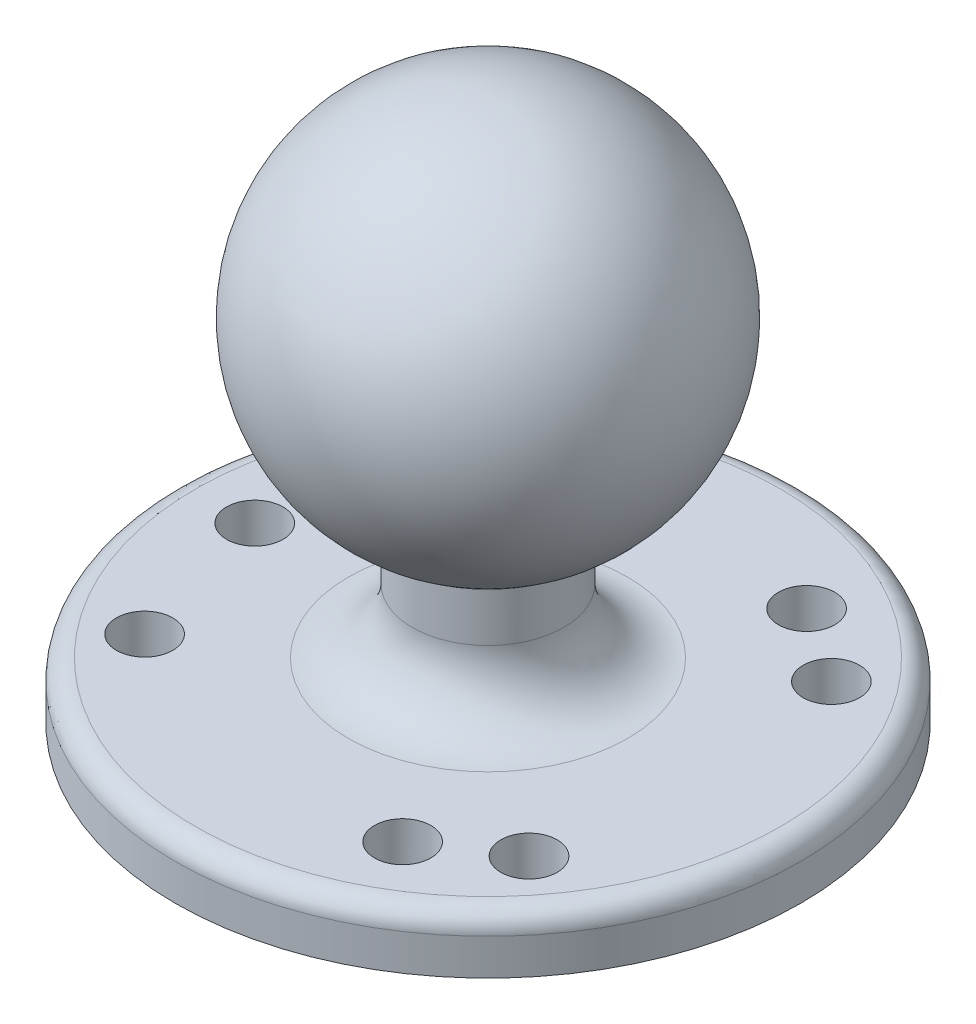
ISO-10303-21;
HEADER;
FILE_DESCRIPTION(('STEP AP214'),'2;1');
FILE_NAME('part.step','',(''),(''),'','','');
FILE_SCHEMA(('AUTOMOTIVE_DESIGN { 1 0 10303 214 1 1 1 1 }'));
ENDSEC;
DATA;
#1=APPLICATION_CONTEXT('core data for automotive mechanical design processes');
#2=APPLICATION_PROTOCOL_DEFINITION('international standard','automotive_design',2000,#1);
#3=PRODUCT_CONTEXT('',#1,'mechanical');
#4=PRODUCT('Part','Part','',(#3));
#5=PRODUCT_RELATED_PRODUCT_CATEGORY('part','',(#4));
#6=PRODUCT_DEFINITION_FORMATION('','',#4);
#7=PRODUCT_DEFINITION_CONTEXT('part definition',#1,'design');
#8=PRODUCT_DEFINITION('design','',#6,#7);
#9=PRODUCT_DEFINITION_SHAPE('','',#8);
#10=(LENGTH_UNIT() NAMED_UNIT(*) SI_UNIT(.MILLI.,.METRE.));
#11=(NAMED_UNIT(*) PLANE_ANGLE_UNIT() SI_UNIT($,.RADIAN.));
#12=(NAMED_UNIT(*) SI_UNIT($,.STERADIAN.) SOLID_ANGLE_UNIT());
#13=UNCERTAINTY_MEASURE_WITH_UNIT(LENGTH_MEASURE(1.E-05),#10,'distance_accuracy_value','');
#14=(GEOMETRIC_REPRESENTATION_CONTEXT(3) GLOBAL_UNCERTAINTY_ASSIGNED_CONTEXT((#13)) GLOBAL_UNIT_ASSIGNED_CONTEXT((#10,
#11,#12)) REPRESENTATION_CONTEXT('',''));
#15=CARTESIAN_POINT('',(0.,0.,0.));
#16=DIRECTION('',(0.,0.,1.));
#17=DIRECTION('',(1.,0.,0.));
#18=AXIS2_PLACEMENT_3D('',#15,#16,#17);
#19=CARTESIAN_POINT('',(0.,0.,0.));
#20=DIRECTION('',(0.,-1.,0.));
#21=DIRECTION('',(0.,0.,-1.));
#22=AXIS2_PLACEMENT_3D('',#19,#20,#21);
#23=PLANE('',#22);
#24=CARTESIAN_POINT('',(-19.05,0.,-14.9860000000001));
#25=DIRECTION('',(0.,-1.,0.));
#26=DIRECTION('',(0.,0.,-1.));
#27=AXIS2_PLACEMENT_3D('',#24,#25,#26);
#28=CIRCLE('',#27,2.794);
#29=CARTESIAN_POINT('',(-19.05,0.,-17.7800000000001));
#30=VERTEX_POINT('',#29);
#31=EDGE_CURVE('E118',#30,#30,#28,.T.);
#32=ORIENTED_EDGE('',*,*,#31,.F.);
#33=EDGE_LOOP('',(#32));
#34=FACE_BOUND('',#33,.T.);
#35=CARTESIAN_POINT('',(19.05,0.,-14.9860000000001));
#36=DIRECTION('',(0.,-1.,0.));
#37=DIRECTION('',(0.,0.,-1.));
#38=AXIS2_PLACEMENT_3D('',#35,#36,#37);
#39=CIRCLE('',#38,2.794);
#40=CARTESIAN_POINT('',(19.05,0.,-17.7800000000001));
#41=VERTEX_POINT('',#40);
#42=EDGE_CURVE('E122',#41,#41,#39,.T.);
#43=ORIENTED_EDGE('',*,*,#42,.F.);
#44=EDGE_LOOP('',(#43));
#45=FACE_BOUND('',#44,.T.);
#46=CARTESIAN_POINT('',(19.05,0.,14.986));
#47=DIRECTION('',(0.,-1.,0.));
#48=DIRECTION('',(0.,0.,-1.));
#49=AXIS2_PLACEMENT_3D('',#46,#47,#48);
#50=CIRCLE('',#49,2.794);
#51=CARTESIAN_POINT('',(19.05,0.,12.192));
#52=VERTEX_POINT('',#51);
#53=EDGE_CURVE('E126',#52,#52,#50,.T.);
#54=ORIENTED_EDGE('',*,*,#53,.F.);
#55=EDGE_LOOP('',(#54));
#56=FACE_BOUND('',#55,.T.);
#57=CARTESIAN_POINT('',(11.557,0.,-20.0173111830735));
#58=DIRECTION('',(0.,-1.,0.));
#59=DIRECTION('',(0.,0.,-1.));
#60=AXIS2_PLACEMENT_3D('',#57,#58,#59);
#61=CIRCLE('',#60,2.794);
#62=CARTESIAN_POINT('',(11.557,0.,-22.8113111830735));
#63=VERTEX_POINT('',#62);
#64=EDGE_CURVE('E79',#63,#63,#61,.T.);
#65=ORIENTED_EDGE('',*,*,#64,.F.);
#66=EDGE_LOOP('',(#65));
#67=FACE_BOUND('',#66,.T.);
#68=CARTESIAN_POINT('',(11.557,0.,20.0173111830735));
#69=DIRECTION('',(0.,-1.,0.));
#70=DIRECTION('',(0.,0.,-1.));
#71=AXIS2_PLACEMENT_3D('',#68,#69,#70);
#72=CIRCLE('',#71,2.794);
#73=CARTESIAN_POINT('',(11.557,0.,17.2233111830735));
#74=VERTEX_POINT('',#73);
#75=EDGE_CURVE('E133',#74,#74,#72,.T.);
#76=ORIENTED_EDGE('',*,*,#75,.F.);
#77=EDGE_LOOP('',(#76));
#78=FACE_BOUND('',#77,.T.);
#79=CARTESIAN_POINT('',(-19.05,0.,14.986));
#80=DIRECTION('',(0.,-1.,0.));
#81=DIRECTION('',(0.,0.,-1.));
#82=AXIS2_PLACEMENT_3D('',#79,#80,#81);
#83=CIRCLE('',#82,2.794);
#84=CARTESIAN_POINT('',(-19.05,0.,12.192));
#85=VERTEX_POINT('',#84);
#86=EDGE_CURVE('E58',#85,#85,#83,.T.);
#87=ORIENTED_EDGE('',*,*,#86,.F.);
#88=EDGE_LOOP('',(#87));
#89=FACE_BOUND('',#88,.T.);
#90=CARTESIAN_POINT('',(-23.114,0.,0.));
#91=DIRECTION('',(0.,-1.,0.));
#92=DIRECTION('',(0.,0.,-1.));
#93=AXIS2_PLACEMENT_3D('',#90,#91,#92);
#94=CIRCLE('',#93,2.794);
#95=CARTESIAN_POINT('',(-23.114,0.,-2.794));
#96=VERTEX_POINT('',#95);
#97=EDGE_CURVE('E53',#96,#96,#94,.T.);
#98=ORIENTED_EDGE('',*,*,#97,.F.);
#99=EDGE_LOOP('',(#98));
#100=FACE_BOUND('',#99,.T.);
#101=CARTESIAN_POINT('',(0.,0.,0.));
#102=DIRECTION('',(0.,-1.,0.));
#103=DIRECTION('',(0.,0.,-1.));
#104=AXIS2_PLACEMENT_3D('',#101,#102,#103);
#105=CIRCLE('',#104,30.988);
#106=CARTESIAN_POINT('',(0.,0.,-30.988));
#107=VERTEX_POINT('',#106);
#108=EDGE_CURVE('E10',#107,#107,#105,.T.);
#109=ORIENTED_EDGE('',*,*,#108,.T.);
#110=EDGE_LOOP('',(#109));
#111=FACE_BOUND('',#110,.T.);
#112=ADVANCED_FACE('F33',(#34,#45,#56,#67,#78,#89,#100,#111),#23,.T.);
#113=CARTESIAN_POINT('',(0.,0.,0.));
#114=DIRECTION('',(0.,-1.,0.));
#115=DIRECTION('',(0.,0.,-1.));
#116=AXIS2_PLACEMENT_3D('',#113,#114,#115);
#117=CYLINDRICAL_SURFACE('',#116,30.988);
#118=CARTESIAN_POINT('',(0.,3.588,0.));
#119=DIRECTION('',(0.,-1.,0.));
#120=DIRECTION('',(0.,0.,-1.));
#121=AXIS2_PLACEMENT_3D('',#118,#119,#120);
#122=CIRCLE('',#121,30.988);
#123=CARTESIAN_POINT('',(0.,3.588,-30.988));
#124=VERTEX_POINT('',#123);
#125=EDGE_CURVE('E40',#124,#124,#122,.T.);
#126=ORIENTED_EDGE('',*,*,#125,.T.);
#127=EDGE_LOOP('',(#126));
#128=FACE_BOUND('',#127,.T.);
#129=ORIENTED_EDGE('',*,*,#108,.F.);
#130=EDGE_LOOP('',(#129));
#131=FACE_BOUND('',#130,.T.);
#132=ADVANCED_FACE('F106',(#128,#131),#117,.T.);
#133=CARTESIAN_POINT('',(0.,3.588,0.));
#134=DIRECTION('',(0.,-1.,0.));
#135=DIRECTION('',(0.,0.,-1.));
#136=AXIS2_PLACEMENT_3D('',#133,#134,#135);
#137=TOROIDAL_SURFACE('',#136,28.988,2.);
#138=CARTESIAN_POINT('',(0.,5.588,0.));
#139=DIRECTION('',(0.,-1.,0.));
#140=DIRECTION('',(0.,0.,-1.));
#141=AXIS2_PLACEMENT_3D('',#138,#139,#140);
#142=CIRCLE('',#141,28.988);
#143=CARTESIAN_POINT('',(0.,5.588,-28.988));
#144=VERTEX_POINT('',#143);
#145=EDGE_CURVE('E45',#144,#144,#142,.T.);
#146=ORIENTED_EDGE('',*,*,#145,.T.);
#147=EDGE_LOOP('',(#146));
#148=FACE_BOUND('',#147,.T.);
#149=ORIENTED_EDGE('',*,*,#125,.F.);
#150=EDGE_LOOP('',(#149));
#151=FACE_BOUND('',#150,.T.);
#152=ADVANCED_FACE('F91',(#148,#151),#137,.T.);
#153=CARTESIAN_POINT('',(28.988,5.588,0.));
#154=DIRECTION('',(0.,1.,0.));
#155=DIRECTION('',(0.,0.,1.));
#156=AXIS2_PLACEMENT_3D('',#153,#154,#155);
#157=PLANE('',#156);
#158=CARTESIAN_POINT('',(-19.05,5.588,-14.9860000000001));
#159=DIRECTION('',(0.,1.,0.));
#160=DIRECTION('',(0.,0.,1.));
#161=AXIS2_PLACEMENT_3D('',#158,#159,#160);
#162=CIRCLE('',#161,2.794);
#163=CARTESIAN_POINT('',(-19.05,5.588,-12.1920000000001));
#164=VERTEX_POINT('',#163);
#165=EDGE_CURVE('E36',#164,#164,#162,.T.);
#166=ORIENTED_EDGE('',*,*,#165,.F.);
#167=EDGE_LOOP('',(#166));
#168=FACE_BOUND('',#167,.T.);
#169=CARTESIAN_POINT('',(19.05,5.588,-14.9860000000001));
#170=DIRECTION('',(0.,1.,0.));
#171=DIRECTION('',(0.,0.,1.));
#172=AXIS2_PLACEMENT_3D('',#169,#170,#171);
#173=CIRCLE('',#172,2.794);
#174=CARTESIAN_POINT('',(19.05,5.588,-12.1920000000001));
#175=VERTEX_POINT('',#174);
#176=EDGE_CURVE('E66',#175,#175,#173,.T.);
#177=ORIENTED_EDGE('',*,*,#176,.F.);
#178=EDGE_LOOP('',(#177));
#179=FACE_BOUND('',#178,.T.);
#180=CARTESIAN_POINT('',(19.05,5.588,14.986));
#181=DIRECTION('',(0.,1.,0.));
#182=DIRECTION('',(0.,0.,1.));
#183=AXIS2_PLACEMENT_3D('',#180,#181,#182);
#184=CIRCLE('',#183,2.794);
#185=CARTESIAN_POINT('',(19.05,5.588,17.78));
#186=VERTEX_POINT('',#185);
#187=EDGE_CURVE('E64',#186,#186,#184,.T.);
#188=ORIENTED_EDGE('',*,*,#187,.F.);
#189=EDGE_LOOP('',(#188));
#190=FACE_BOUND('',#189,.T.);
#191=CARTESIAN_POINT('',(11.557,5.588,-20.0173111830735));
#192=DIRECTION('',(0.,1.,0.));
#193=DIRECTION('',(0.,0.,1.));
#194=AXIS2_PLACEMENT_3D('',#191,#192,#193);
#195=CIRCLE('',#194,2.794);
#196=CARTESIAN_POINT('',(11.557,5.588,-17.2233111830735));
#197=VERTEX_POINT('',#196);
#198=EDGE_CURVE('E61',#197,#197,#195,.T.);
#199=ORIENTED_EDGE('',*,*,#198,.F.);
#200=EDGE_LOOP('',(#199));
#201=FACE_BOUND('',#200,.T.);
#202=CARTESIAN_POINT('',(11.557,5.588,20.0173111830735));
#203=DIRECTION('',(0.,1.,0.));
#204=DIRECTION('',(0.,0.,1.));
#205=AXIS2_PLACEMENT_3D('',#202,#203,#204);
#206=CIRCLE('',#205,2.794);
#207=CARTESIAN_POINT('',(11.557,5.588,22.8113111830735));
#208=VERTEX_POINT('',#207);
#209=EDGE_CURVE('E57',#208,#208,#206,.T.);
#210=ORIENTED_EDGE('',*,*,#209,.F.);
#211=EDGE_LOOP('',(#210));
#212=FACE_BOUND('',#211,.T.);
#213=CARTESIAN_POINT('',(-19.05,5.588,14.986));
#214=DIRECTION('',(0.,1.,0.));
#215=DIRECTION('',(0.,0.,1.));
#216=AXIS2_PLACEMENT_3D('',#213,#214,#215);
#217=CIRCLE('',#216,2.794);
#218=CARTESIAN_POINT('',(-19.05,5.588,17.78));
#219=VERTEX_POINT('',#218);
#220=EDGE_CURVE('E54',#219,#219,#217,.T.);
#221=ORIENTED_EDGE('',*,*,#220,.F.);
#222=EDGE_LOOP('',(#221));
#223=FACE_BOUND('',#222,.T.);
#224=CARTESIAN_POINT('',(-23.114,5.588,0.));
#225=DIRECTION('',(0.,1.,0.));
#226=DIRECTION('',(0.,0.,1.));
#227=AXIS2_PLACEMENT_3D('',#224,#225,#226);
#228=CIRCLE('',#227,2.794);
#229=CARTESIAN_POINT('',(-23.114,5.588,2.794));
#230=VERTEX_POINT('',#229);
#231=EDGE_CURVE('E49',#230,#230,#228,.T.);
#232=ORIENTED_EDGE('',*,*,#231,.F.);
#233=EDGE_LOOP('',(#232));
#234=FACE_BOUND('',#233,.T.);
#235=CARTESIAN_POINT('',(0.,5.588,0.));
#236=DIRECTION('',(0.,-1.,0.));
#237=DIRECTION('',(0.,0.,-1.));
#238=AXIS2_PLACEMENT_3D('',#235,#236,#237);
#239=CIRCLE('',#238,13.85);
#240=CARTESIAN_POINT('',(0.,5.588,-13.85));
#241=VERTEX_POINT('',#240);
#242=EDGE_CURVE('E86',#241,#241,#239,.T.);
#243=ORIENTED_EDGE('',*,*,#242,.T.);
#244=EDGE_LOOP('',(#243));
#245=FACE_BOUND('',#244,.T.);
#246=ORIENTED_EDGE('',*,*,#145,.F.);
#247=EDGE_LOOP('',(#246));
#248=FACE_BOUND('',#247,.T.);
#249=ADVANCED_FACE('F94',(#168,#179,#190,#201,#212,#223,#234,#245,#248),#157,.T.);
#250=CARTESIAN_POINT('',(0.,11.938,0.));
#251=DIRECTION('',(0.,-1.,0.));
#252=DIRECTION('',(0.,0.,-1.));
#253=AXIS2_PLACEMENT_3D('',#250,#251,#252);
#254=TOROIDAL_SURFACE('',#253,13.85,6.35);
#255=CARTESIAN_POINT('',(0.,11.938,0.));
#256=DIRECTION('',(0.,-1.,0.));
#257=DIRECTION('',(0.,0.,-1.));
#258=AXIS2_PLACEMENT_3D('',#255,#256,#257);
#259=CIRCLE('',#258,7.5);
#260=CARTESIAN_POINT('',(0.,11.938,-7.5));
#261=VERTEX_POINT('',#260);
#262=EDGE_CURVE('E83',#261,#261,#259,.T.);
#263=ORIENTED_EDGE('',*,*,#262,.T.);
#264=EDGE_LOOP('',(#263));
#265=FACE_BOUND('',#264,.T.);
#266=ORIENTED_EDGE('',*,*,#242,.F.);
#267=EDGE_LOOP('',(#266));
#268=FACE_BOUND('',#267,.T.);
#269=ADVANCED_FACE('F96',(#265,#268),#254,.F.);
#270=CARTESIAN_POINT('',(0.,0.,0.));
#271=DIRECTION('',(0.,-1.,0.));
#272=DIRECTION('',(0.,0.,-1.));
#273=AXIS2_PLACEMENT_3D('',#270,#271,#272);
#274=CYLINDRICAL_SURFACE('',#273,7.5);
#275=CARTESIAN_POINT('',(0.,17.2865037760904,0.));
#276=DIRECTION('',(0.,-1.,0.));
#277=DIRECTION('',(0.,0.,-1.));
#278=AXIS2_PLACEMENT_3D('',#275,#276,#277);
#279=CIRCLE('',#278,7.5);
#280=CARTESIAN_POINT('',(0.,17.2865037760904,-7.5));
#281=VERTEX_POINT('',#280);
#282=EDGE_CURVE('E52',#281,#281,#279,.T.);
#283=ORIENTED_EDGE('',*,*,#282,.T.);
#284=EDGE_LOOP('',(#283));
#285=FACE_BOUND('',#284,.T.);
#286=ORIENTED_EDGE('',*,*,#262,.F.);
#287=EDGE_LOOP('',(#286));
#288=FACE_BOUND('',#287,.T.);
#289=ADVANCED_FACE('F103',(#285,#288),#274,.T.);
#290=CARTESIAN_POINT('',(0.,34.798,0.));
#291=DIRECTION('',(0.,-1.,0.));
#292=DIRECTION('',(1.,0.,0.));
#293=AXIS2_PLACEMENT_3D('',#290,#291,#292);
#294=SPHERICAL_SURFACE('',#293,19.05);
#295=ORIENTED_EDGE('',*,*,#282,.F.);
#296=EDGE_LOOP('',(#295));
#297=FACE_BOUND('',#296,.T.);
#298=ADVANCED_FACE('F165',(#297),#294,.T.);
#299=CARTESIAN_POINT('',(-23.114,10.,0.));
#300=DIRECTION('',(0.,-1.,0.));
#301=DIRECTION('',(0.,0.,-1.));
#302=AXIS2_PLACEMENT_3D('',#299,#300,#301);
#303=CYLINDRICAL_SURFACE('',#302,2.794);
#304=ORIENTED_EDGE('',*,*,#231,.T.);
#305=EDGE_LOOP('',(#304));
#306=FACE_BOUND('',#305,.T.);
#307=ORIENTED_EDGE('',*,*,#97,.T.);
#308=EDGE_LOOP('',(#307));
#309=FACE_BOUND('',#308,.T.);
#310=ADVANCED_FACE('F162',(#306,#309),#303,.F.);
#311=CARTESIAN_POINT('',(-19.05,10.,14.986));
#312=DIRECTION('',(0.,-1.,0.));
#313=DIRECTION('',(0.,0.,-1.));
#314=AXIS2_PLACEMENT_3D('',#311,#312,#313);
#315=CYLINDRICAL_SURFACE('',#314,2.794);
#316=ORIENTED_EDGE('',*,*,#220,.T.);
#317=EDGE_LOOP('',(#316));
#318=FACE_BOUND('',#317,.T.);
#319=ORIENTED_EDGE('',*,*,#86,.T.);
#320=EDGE_LOOP('',(#319));
#321=FACE_BOUND('',#320,.T.);
#322=ADVANCED_FACE('F157',(#318,#321),#315,.F.);
#323=CARTESIAN_POINT('',(11.557,10.,20.0173111830735));
#324=DIRECTION('',(0.,-1.,0.));
#325=DIRECTION('',(0.,0.,-1.));
#326=AXIS2_PLACEMENT_3D('',#323,#324,#325);
#327=CYLINDRICAL_SURFACE('',#326,2.794);
#328=ORIENTED_EDGE('',*,*,#209,.T.);
#329=EDGE_LOOP('',(#328));
#330=FACE_BOUND('',#329,.T.);
#331=ORIENTED_EDGE('',*,*,#75,.T.);
#332=EDGE_LOOP('',(#331));
#333=FACE_BOUND('',#332,.T.);
#334=ADVANCED_FACE('F147',(#330,#333),#327,.F.);
#335=CARTESIAN_POINT('',(11.557,10.,-20.0173111830735));
#336=DIRECTION('',(0.,-1.,0.));
#337=DIRECTION('',(0.,0.,-1.));
#338=AXIS2_PLACEMENT_3D('',#335,#336,#337);
#339=CYLINDRICAL_SURFACE('',#338,2.794);
#340=ORIENTED_EDGE('',*,*,#198,.T.);
#341=EDGE_LOOP('',(#340));
#342=FACE_BOUND('',#341,.T.);
#343=ORIENTED_EDGE('',*,*,#64,.T.);
#344=EDGE_LOOP('',(#343));
#345=FACE_BOUND('',#344,.T.);
#346=ADVANCED_FACE('F144',(#342,#345),#339,.F.);
#347=CARTESIAN_POINT('',(19.05,10.,14.986));
#348=DIRECTION('',(0.,-1.,0.));
#349=DIRECTION('',(0.,0.,-1.));
#350=AXIS2_PLACEMENT_3D('',#347,#348,#349);
#351=CYLINDRICAL_SURFACE('',#350,2.794);
#352=ORIENTED_EDGE('',*,*,#187,.T.);
#353=EDGE_LOOP('',(#352));
#354=FACE_BOUND('',#353,.T.);
#355=ORIENTED_EDGE('',*,*,#53,.T.);
#356=EDGE_LOOP('',(#355));
#357=FACE_BOUND('',#356,.T.);
#358=ADVANCED_FACE('F146',(#354,#357),#351,.F.);
#359=CARTESIAN_POINT('',(19.05,10.,-14.9860000000001));
#360=DIRECTION('',(0.,-1.,0.));
#361=DIRECTION('',(0.,0.,-1.));
#362=AXIS2_PLACEMENT_3D('',#359,#360,#361);
#363=CYLINDRICAL_SURFACE('',#362,2.794);
#364=ORIENTED_EDGE('',*,*,#176,.T.);
#365=EDGE_LOOP('',(#364));
#366=FACE_BOUND('',#365,.T.);
#367=ORIENTED_EDGE('',*,*,#42,.T.);
#368=EDGE_LOOP('',(#367));
#369=FACE_BOUND('',#368,.T.);
#370=ADVANCED_FACE('F154',(#366,#369),#363,.F.);
#371=CARTESIAN_POINT('',(-19.05,10.,-14.9860000000001));
#372=DIRECTION('',(0.,-1.,0.));
#373=DIRECTION('',(0.,0.,-1.));
#374=AXIS2_PLACEMENT_3D('',#371,#372,#373);
#375=CYLINDRICAL_SURFACE('',#374,2.794);
#376=ORIENTED_EDGE('',*,*,#165,.T.);
#377=EDGE_LOOP('',(#376));
#378=FACE_BOUND('',#377,.T.);
#379=ORIENTED_EDGE('',*,*,#31,.T.);
#380=EDGE_LOOP('',(#379));
#381=FACE_BOUND('',#380,.T.);
#382=ADVANCED_FACE('F219',(#378,#381),#375,.F.);
#383=CLOSED_SHELL('',(#112,#132,#152,#249,#269,#289,#298,#310,#322,#334,#346,#358,#370,#382));
#384=MANIFOLD_SOLID_BREP('B2',#383);
#385=ADVANCED_BREP_SHAPE_REPRESENTATION('',(#18,#384),#14);
#386=SHAPE_DEFINITION_REPRESENTATION(#9,#385);
ENDSEC;
END-ISO-10303-21;
